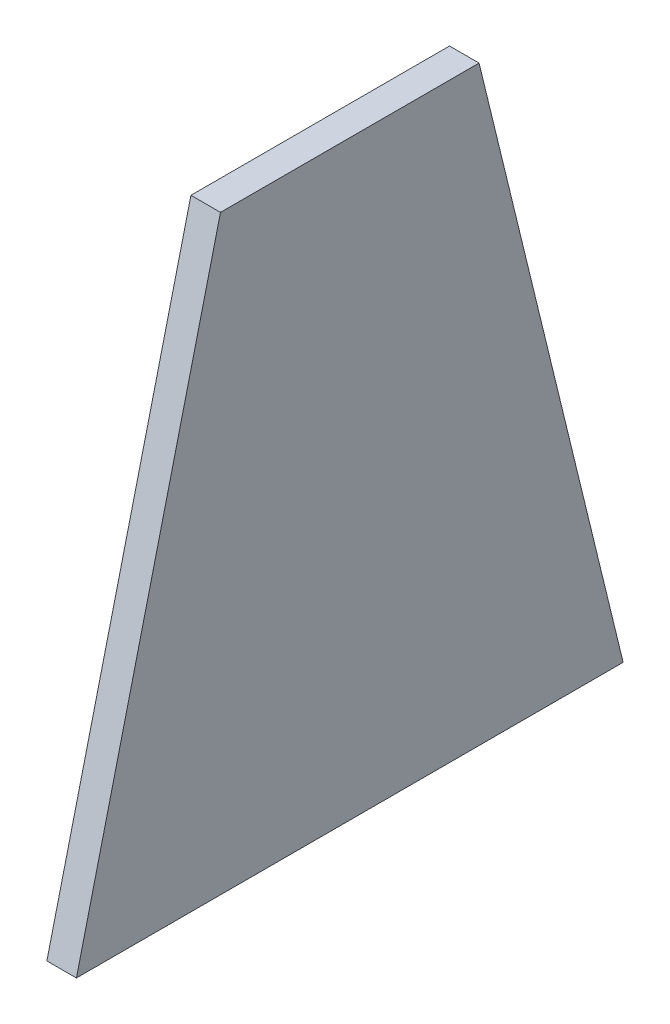
ISO-10303-21;
HEADER;
FILE_DESCRIPTION(('STEP AP214'),'2;1');
FILE_NAME('part.step','',(''),(''),'','','');
FILE_SCHEMA(('AUTOMOTIVE_DESIGN { 1 0 10303 214 1 1 1 1 }'));
ENDSEC;
DATA;
#1=APPLICATION_CONTEXT('core data for automotive mechanical design processes');
#2=APPLICATION_PROTOCOL_DEFINITION('international standard','automotive_design',2000,#1);
#3=PRODUCT_CONTEXT('',#1,'mechanical');
#4=PRODUCT('Part','Part','',(#3));
#5=PRODUCT_RELATED_PRODUCT_CATEGORY('part','',(#4));
#6=PRODUCT_DEFINITION_FORMATION('','',#4);
#7=PRODUCT_DEFINITION_CONTEXT('part definition',#1,'design');
#8=PRODUCT_DEFINITION('design','',#6,#7);
#9=PRODUCT_DEFINITION_SHAPE('','',#8);
#10=(LENGTH_UNIT() NAMED_UNIT(*) SI_UNIT(.MILLI.,.METRE.));
#11=(NAMED_UNIT(*) PLANE_ANGLE_UNIT() SI_UNIT($,.RADIAN.));
#12=(NAMED_UNIT(*) SI_UNIT($,.STERADIAN.) SOLID_ANGLE_UNIT());
#13=UNCERTAINTY_MEASURE_WITH_UNIT(LENGTH_MEASURE(1.E-05),#10,'distance_accuracy_value','');
#14=(GEOMETRIC_REPRESENTATION_CONTEXT(3) GLOBAL_UNCERTAINTY_ASSIGNED_CONTEXT((#13)) GLOBAL_UNIT_ASSIGNED_CONTEXT((#10,
#11,#12)) REPRESENTATION_CONTEXT('',''));
#15=CARTESIAN_POINT('',(0.,0.,0.));
#16=DIRECTION('',(0.,0.,1.));
#17=DIRECTION('',(1.,0.,0.));
#18=AXIS2_PLACEMENT_3D('',#15,#16,#17);
#19=CARTESIAN_POINT('',(4.,80.,-17.5));
#20=DIRECTION('',(0.,0.236816390640513,-0.971554423140567));
#21=DIRECTION('',(0.,0.971554423140567,0.236816390640513));
#22=AXIS2_PLACEMENT_3D('',#19,#20,#21);
#23=PLANE('',#22);
#24=DIRECTION('',(0.,-0.971554423140567,-0.236816390640513));
#25=VECTOR('',#24,1.);
#26=CARTESIAN_POINT('',(0.,80.,-17.5));
#27=LINE('',#26,#25);
#28=CARTESIAN_POINT('',(0.,80.,-17.5));
#29=VERTEX_POINT('',#28);
#30=CARTESIAN_POINT('',(0.,0.,-37.));
#31=VERTEX_POINT('',#30);
#32=EDGE_CURVE('E98',#29,#31,#27,.T.);
#33=ORIENTED_EDGE('',*,*,#32,.F.);
#34=DIRECTION('',(-1.,0.,0.));
#35=VECTOR('',#34,1.);
#36=CARTESIAN_POINT('',(4.,80.,-17.5));
#37=LINE('',#36,#35);
#38=CARTESIAN_POINT('',(4.,80.,-17.5));
#39=VERTEX_POINT('',#38);
#40=EDGE_CURVE('E11',#39,#29,#37,.T.);
#41=ORIENTED_EDGE('',*,*,#40,.F.);
#42=DIRECTION('',(0.,-0.971554423140567,-0.236816390640513));
#43=VECTOR('',#42,1.);
#44=CARTESIAN_POINT('',(4.,80.,-17.5));
#45=LINE('',#44,#43);
#46=CARTESIAN_POINT('',(4.,0.,-37.));
#47=VERTEX_POINT('',#46);
#48=EDGE_CURVE('E93',#39,#47,#45,.T.);
#49=ORIENTED_EDGE('',*,*,#48,.T.);
#50=DIRECTION('',(-1.,0.,0.));
#51=VECTOR('',#50,1.);
#52=CARTESIAN_POINT('',(4.,0.,-37.));
#53=LINE('',#52,#51);
#54=EDGE_CURVE('E36',#47,#31,#53,.T.);
#55=ORIENTED_EDGE('',*,*,#54,.T.);
#56=EDGE_LOOP('',(#33,#41,#49,#55));
#57=FACE_BOUND('',#56,.T.);
#58=ADVANCED_FACE('F33',(#57),#23,.T.);
#59=CARTESIAN_POINT('',(4.,80.,-17.5));
#60=DIRECTION('',(0.,-1.,0.));
#61=DIRECTION('',(0.,0.,-1.));
#62=AXIS2_PLACEMENT_3D('',#59,#60,#61);
#63=PLANE('',#62);
#64=DIRECTION('',(0.,0.,1.));
#65=VECTOR('',#64,1.);
#66=CARTESIAN_POINT('',(0.,80.,-17.5));
#67=LINE('',#66,#65);
#68=CARTESIAN_POINT('',(0.,80.,17.5));
#69=VERTEX_POINT('',#68);
#70=EDGE_CURVE('E66',#29,#69,#67,.T.);
#71=ORIENTED_EDGE('',*,*,#70,.T.);
#72=DIRECTION('',(-1.,0.,0.));
#73=VECTOR('',#72,1.);
#74=CARTESIAN_POINT('',(4.,80.,17.5));
#75=LINE('',#74,#73);
#76=CARTESIAN_POINT('',(4.,80.,17.5));
#77=VERTEX_POINT('',#76);
#78=EDGE_CURVE('E42',#77,#69,#75,.T.);
#79=ORIENTED_EDGE('',*,*,#78,.F.);
#80=DIRECTION('',(0.,0.,1.));
#81=VECTOR('',#80,1.);
#82=CARTESIAN_POINT('',(4.,80.,-17.5));
#83=LINE('',#82,#81);
#84=EDGE_CURVE('E81',#39,#77,#83,.T.);
#85=ORIENTED_EDGE('',*,*,#84,.F.);
#86=ORIENTED_EDGE('',*,*,#40,.T.);
#87=EDGE_LOOP('',(#71,#79,#85,#86));
#88=FACE_BOUND('',#87,.T.);
#89=ADVANCED_FACE('F108',(#88),#63,.F.);
#90=CARTESIAN_POINT('',(4.,80.,17.5));
#91=DIRECTION('',(0.,-0.236816390640513,-0.971554423140567));
#92=DIRECTION('',(0.,0.971554423140567,-0.236816390640513));
#93=AXIS2_PLACEMENT_3D('',#90,#91,#92);
#94=PLANE('',#93);
#95=DIRECTION('',(0.,-0.971554423140567,0.236816390640513));
#96=VECTOR('',#95,1.);
#97=CARTESIAN_POINT('',(0.,80.,17.5));
#98=LINE('',#97,#96);
#99=CARTESIAN_POINT('',(0.,0.,37.));
#100=VERTEX_POINT('',#99);
#101=EDGE_CURVE('E88',#69,#100,#98,.T.);
#102=ORIENTED_EDGE('',*,*,#101,.T.);
#103=DIRECTION('',(-1.,0.,0.));
#104=VECTOR('',#103,1.);
#105=CARTESIAN_POINT('',(4.,0.,37.));
#106=LINE('',#105,#104);
#107=CARTESIAN_POINT('',(4.,0.,37.));
#108=VERTEX_POINT('',#107);
#109=EDGE_CURVE('E85',#108,#100,#106,.T.);
#110=ORIENTED_EDGE('',*,*,#109,.F.);
#111=DIRECTION('',(0.,-0.971554423140567,0.236816390640513));
#112=VECTOR('',#111,1.);
#113=CARTESIAN_POINT('',(4.,80.,17.5));
#114=LINE('',#113,#112);
#115=EDGE_CURVE('E78',#77,#108,#114,.T.);
#116=ORIENTED_EDGE('',*,*,#115,.F.);
#117=ORIENTED_EDGE('',*,*,#78,.T.);
#118=EDGE_LOOP('',(#102,#110,#116,#117));
#119=FACE_BOUND('',#118,.T.);
#120=ADVANCED_FACE('F86',(#119),#94,.F.);
#121=CARTESIAN_POINT('',(4.,0.,37.));
#122=DIRECTION('',(0.,1.,0.));
#123=DIRECTION('',(0.,0.,1.));
#124=AXIS2_PLACEMENT_3D('',#121,#122,#123);
#125=PLANE('',#124);
#126=DIRECTION('',(0.,0.,-1.));
#127=VECTOR('',#126,1.);
#128=CARTESIAN_POINT('',(0.,0.,37.));
#129=LINE('',#128,#127);
#130=EDGE_CURVE('E101',#100,#31,#129,.T.);
#131=ORIENTED_EDGE('',*,*,#130,.T.);
#132=ORIENTED_EDGE('',*,*,#54,.F.);
#133=DIRECTION('',(0.,0.,-1.));
#134=VECTOR('',#133,1.);
#135=CARTESIAN_POINT('',(4.,0.,37.));
#136=LINE('',#135,#134);
#137=EDGE_CURVE('E75',#108,#47,#136,.T.);
#138=ORIENTED_EDGE('',*,*,#137,.F.);
#139=ORIENTED_EDGE('',*,*,#109,.T.);
#140=EDGE_LOOP('',(#131,#132,#138,#139));
#141=FACE_BOUND('',#140,.T.);
#142=ADVANCED_FACE('F92',(#141),#125,.F.);
#143=CARTESIAN_POINT('',(4.,0.,0.));
#144=DIRECTION('',(1.,0.,0.));
#145=DIRECTION('',(0.,0.,-1.));
#146=AXIS2_PLACEMENT_3D('',#143,#144,#145);
#147=PLANE('',#146);
#148=ORIENTED_EDGE('',*,*,#48,.F.);
#149=ORIENTED_EDGE('',*,*,#84,.T.);
#150=ORIENTED_EDGE('',*,*,#115,.T.);
#151=ORIENTED_EDGE('',*,*,#137,.T.);
#152=EDGE_LOOP('',(#148,#149,#150,#151));
#153=FACE_BOUND('',#152,.T.);
#154=ADVANCED_FACE('F80',(#153),#147,.T.);
#155=CARTESIAN_POINT('',(0.,0.,0.));
#156=DIRECTION('',(1.,0.,0.));
#157=DIRECTION('',(0.,0.,-1.));
#158=AXIS2_PLACEMENT_3D('',#155,#156,#157);
#159=PLANE('',#158);
#160=ORIENTED_EDGE('',*,*,#32,.T.);
#161=ORIENTED_EDGE('',*,*,#130,.F.);
#162=ORIENTED_EDGE('',*,*,#101,.F.);
#163=ORIENTED_EDGE('',*,*,#70,.F.);
#164=EDGE_LOOP('',(#160,#161,#162,#163));
#165=FACE_BOUND('',#164,.T.);
#166=ADVANCED_FACE('F106',(#165),#159,.F.);
#167=CLOSED_SHELL('',(#58,#89,#120,#142,#154,#166));
#168=MANIFOLD_SOLID_BREP('B2',#167);
#169=ADVANCED_BREP_SHAPE_REPRESENTATION('',(#18,#168),#14);
#170=SHAPE_DEFINITION_REPRESENTATION(#9,#169);
ENDSEC;
END-ISO-10303-21;
